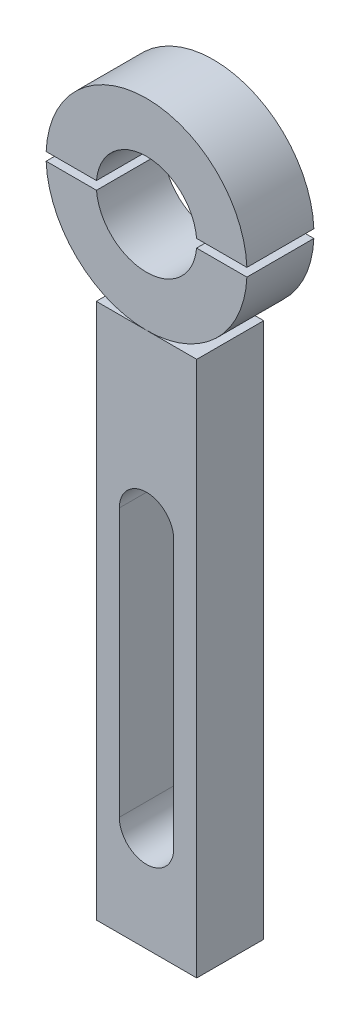
ISO-10303-21;
HEADER;
FILE_DESCRIPTION(('STEP AP214'),'2;1');
FILE_NAME('part.step','',(''),(''),'','','');
FILE_SCHEMA(('AUTOMOTIVE_DESIGN { 1 0 10303 214 1 1 1 1 }'));
ENDSEC;
DATA;
#1=APPLICATION_CONTEXT('core data for automotive mechanical design processes');
#2=APPLICATION_PROTOCOL_DEFINITION('international standard','automotive_design',2000,#1);
#3=PRODUCT_CONTEXT('',#1,'mechanical');
#4=PRODUCT('Part','Part','',(#3));
#5=PRODUCT_RELATED_PRODUCT_CATEGORY('part','',(#4));
#6=PRODUCT_DEFINITION_FORMATION('','',#4);
#7=PRODUCT_DEFINITION_CONTEXT('part definition',#1,'design');
#8=PRODUCT_DEFINITION('design','',#6,#7);
#9=PRODUCT_DEFINITION_SHAPE('','',#8);
#10=(LENGTH_UNIT() NAMED_UNIT(*) SI_UNIT(.MILLI.,.METRE.));
#11=(NAMED_UNIT(*) PLANE_ANGLE_UNIT() SI_UNIT($,.RADIAN.));
#12=(NAMED_UNIT(*) SI_UNIT($,.STERADIAN.) SOLID_ANGLE_UNIT());
#13=UNCERTAINTY_MEASURE_WITH_UNIT(LENGTH_MEASURE(1.E-05),#10,'distance_accuracy_value','');
#14=(GEOMETRIC_REPRESENTATION_CONTEXT(3) GLOBAL_UNCERTAINTY_ASSIGNED_CONTEXT((#13)) GLOBAL_UNIT_ASSIGNED_CONTEXT((#10,
#11,#12)) REPRESENTATION_CONTEXT('',''));
#15=CARTESIAN_POINT('',(0.,0.,0.));
#16=DIRECTION('',(0.,0.,1.));
#17=DIRECTION('',(1.,0.,0.));
#18=AXIS2_PLACEMENT_3D('',#15,#16,#17);
#19=CARTESIAN_POINT('',(-9.52500000000005,-19.05,-6.35000000000008));
#20=DIRECTION('',(-1.,0.,0.));
#21=DIRECTION('',(0.,-1.,0.));
#22=AXIS2_PLACEMENT_3D('',#19,#20,#21);
#23=PLANE('',#22);
#24=DIRECTION('',(0.,-1.,0.));
#25=VECTOR('',#24,1.);
#26=CARTESIAN_POINT('',(-9.52500000000005,-19.05,6.35000000000008));
#27=LINE('',#26,#25);
#28=CARTESIAN_POINT('',(-9.52500000000005,-19.05,6.35000000000008));
#29=VERTEX_POINT('',#28);
#30=CARTESIAN_POINT('',(-9.52500000000005,-120.65,6.35000000000008));
#31=VERTEX_POINT('',#30);
#32=EDGE_CURVE('E146',#29,#31,#27,.T.);
#33=ORIENTED_EDGE('',*,*,#32,.F.);
#34=DIRECTION('',(0.,0.,1.));
#35=VECTOR('',#34,1.);
#36=CARTESIAN_POINT('',(-9.52500000000005,-19.05,-6.35000000000008));
#37=LINE('',#36,#35);
#38=CARTESIAN_POINT('',(-9.52500000000005,-19.05,-6.35000000000008));
#39=VERTEX_POINT('',#38);
#40=EDGE_CURVE('E12',#39,#29,#37,.T.);
#41=ORIENTED_EDGE('',*,*,#40,.F.);
#42=DIRECTION('',(0.,-1.,0.));
#43=VECTOR('',#42,1.);
#44=CARTESIAN_POINT('',(-9.52500000000005,-19.05,-6.35000000000008));
#45=LINE('',#44,#43);
#46=CARTESIAN_POINT('',(-9.52500000000006,-120.65,-6.35000000000008));
#47=VERTEX_POINT('',#46);
#48=EDGE_CURVE('E160',#39,#47,#45,.T.);
#49=ORIENTED_EDGE('',*,*,#48,.T.);
#50=DIRECTION('',(0.,0.,1.));
#51=VECTOR('',#50,1.);
#52=CARTESIAN_POINT('',(-9.52500000000006,-120.65,-6.35000000000008));
#53=LINE('',#52,#51);
#54=EDGE_CURVE('E50',#47,#31,#53,.T.);
#55=ORIENTED_EDGE('',*,*,#54,.T.);
#56=EDGE_LOOP('',(#33,#41,#49,#55));
#57=FACE_BOUND('',#56,.T.);
#58=ADVANCED_FACE('F47',(#57),#23,.T.);
#59=CARTESIAN_POINT('',(-9.52500000000005,-19.05,-6.35000000000008));
#60=DIRECTION('',(0.,1.,0.));
#61=DIRECTION('',(0.,0.,1.));
#62=AXIS2_PLACEMENT_3D('',#59,#60,#61);
#63=PLANE('',#62);
#64=DIRECTION('',(-1.,0.,0.));
#65=VECTOR('',#64,1.);
#66=CARTESIAN_POINT('',(-9.52500000000005,-19.05,6.35000000000008));
#67=LINE('',#66,#65);
#68=CARTESIAN_POINT('',(9.525,-19.05,6.35000000000008));
#69=VERTEX_POINT('',#68);
#70=EDGE_CURVE('E157',#69,#29,#67,.T.);
#71=ORIENTED_EDGE('',*,*,#70,.F.);
#72=DIRECTION('',(0.,0.,1.));
#73=VECTOR('',#72,1.);
#74=CARTESIAN_POINT('',(9.52499999999997,-19.05,-6.35000000000008));
#75=LINE('',#74,#73);
#76=CARTESIAN_POINT('',(9.52499999999997,-19.05,-6.35000000000008));
#77=VERTEX_POINT('',#76);
#78=EDGE_CURVE('E55',#77,#69,#75,.T.);
#79=ORIENTED_EDGE('',*,*,#78,.F.);
#80=DIRECTION('',(-1.,0.,0.));
#81=VECTOR('',#80,1.);
#82=CARTESIAN_POINT('',(-9.52500000000005,-19.05,-6.35000000000008));
#83=LINE('',#82,#81);
#84=EDGE_CURVE('E169',#77,#39,#83,.T.);
#85=ORIENTED_EDGE('',*,*,#84,.T.);
#86=ORIENTED_EDGE('',*,*,#40,.T.);
#87=EDGE_LOOP('',(#71,#79,#85,#86));
#88=FACE_BOUND('',#87,.T.);
#89=ADVANCED_FACE('F183',(#88),#63,.T.);
#90=CARTESIAN_POINT('',(9.52499999999997,-19.05,-6.35000000000008));
#91=DIRECTION('',(1.,0.,0.));
#92=DIRECTION('',(0.,1.,0.));
#93=AXIS2_PLACEMENT_3D('',#90,#91,#92);
#94=PLANE('',#93);
#95=DIRECTION('',(0.,1.,0.));
#96=VECTOR('',#95,1.);
#97=CARTESIAN_POINT('',(9.525,-19.05,6.35000000000008));
#98=LINE('',#97,#96);
#99=CARTESIAN_POINT('',(9.52500000000003,-120.65,6.35000000000008));
#100=VERTEX_POINT('',#99);
#101=EDGE_CURVE('E154',#100,#69,#98,.T.);
#102=ORIENTED_EDGE('',*,*,#101,.F.);
#103=DIRECTION('',(0.,0.,1.));
#104=VECTOR('',#103,1.);
#105=CARTESIAN_POINT('',(9.52500000000003,-120.65,-6.35000000000008));
#106=LINE('',#105,#104);
#107=CARTESIAN_POINT('',(9.52500000000003,-120.65,-6.35000000000008));
#108=VERTEX_POINT('',#107);
#109=EDGE_CURVE('E172',#108,#100,#106,.T.);
#110=ORIENTED_EDGE('',*,*,#109,.F.);
#111=DIRECTION('',(0.,1.,0.));
#112=VECTOR('',#111,1.);
#113=CARTESIAN_POINT('',(9.52499999999997,-19.05,-6.35000000000008));
#114=LINE('',#113,#112);
#115=EDGE_CURVE('E166',#108,#77,#114,.T.);
#116=ORIENTED_EDGE('',*,*,#115,.T.);
#117=ORIENTED_EDGE('',*,*,#78,.T.);
#118=EDGE_LOOP('',(#102,#110,#116,#117));
#119=FACE_BOUND('',#118,.T.);
#120=ADVANCED_FACE('F189',(#119),#94,.T.);
#121=CARTESIAN_POINT('',(-9.52500000000006,-120.65,-6.35000000000008));
#122=DIRECTION('',(0.,-1.,0.));
#123=DIRECTION('',(0.,0.,-1.));
#124=AXIS2_PLACEMENT_3D('',#121,#122,#123);
#125=PLANE('',#124);
#126=DIRECTION('',(1.,0.,0.));
#127=VECTOR('',#126,1.);
#128=CARTESIAN_POINT('',(-9.52500000000005,-120.65,6.35000000000008));
#129=LINE('',#128,#127);
#130=EDGE_CURVE('E151',#31,#100,#129,.T.);
#131=ORIENTED_EDGE('',*,*,#130,.F.);
#132=ORIENTED_EDGE('',*,*,#54,.F.);
#133=DIRECTION('',(1.,0.,0.));
#134=VECTOR('',#133,1.);
#135=CARTESIAN_POINT('',(-9.52500000000006,-120.65,-6.35000000000008));
#136=LINE('',#135,#134);
#137=EDGE_CURVE('E163',#47,#108,#136,.T.);
#138=ORIENTED_EDGE('',*,*,#137,.T.);
#139=ORIENTED_EDGE('',*,*,#109,.T.);
#140=EDGE_LOOP('',(#131,#132,#138,#139));
#141=FACE_BOUND('',#140,.T.);
#142=ADVANCED_FACE('F180',(#141),#125,.T.);
#143=CARTESIAN_POINT('',(-9.52500000000005,-19.05,-6.35000000000008));
#144=DIRECTION('',(0.,0.,1.));
#145=DIRECTION('',(1.,0.,0.));
#146=AXIS2_PLACEMENT_3D('',#143,#144,#145);
#147=PLANE('',#146);
#148=DIRECTION('',(0.,-1.,0.));
#149=VECTOR('',#148,1.);
#150=CARTESIAN_POINT('',(-5.15937500000006,-101.6,-6.35000000000008));
#151=LINE('',#150,#149);
#152=CARTESIAN_POINT('',(-5.15937500000005,-50.8000000000001,-6.35000000000008));
#153=VERTEX_POINT('',#152);
#154=CARTESIAN_POINT('',(-5.15937500000006,-101.6,-6.35000000000008));
#155=VERTEX_POINT('',#154);
#156=EDGE_CURVE('E141',#153,#155,#151,.T.);
#157=ORIENTED_EDGE('',*,*,#156,.T.);
#158=CARTESIAN_POINT('',(0.,-101.6,-6.35000000000008));
#159=DIRECTION('',(0.,0.,1.));
#160=DIRECTION('',(1.,0.,0.));
#161=AXIS2_PLACEMENT_3D('',#158,#159,#160);
#162=CIRCLE('',#161,5.159375);
#163=CARTESIAN_POINT('',(5.15937500000002,-101.6,-6.35000000000008));
#164=VERTEX_POINT('',#163);
#165=EDGE_CURVE('E132',#155,#164,#162,.T.);
#166=ORIENTED_EDGE('',*,*,#165,.T.);
#167=DIRECTION('',(0.,1.,0.));
#168=VECTOR('',#167,1.);
#169=CARTESIAN_POINT('',(5.15937500000001,-50.8000000000001,-6.35000000000008));
#170=LINE('',#169,#168);
#171=CARTESIAN_POINT('',(5.15937500000001,-50.8000000000001,-6.35000000000008));
#172=VERTEX_POINT('',#171);
#173=EDGE_CURVE('E138',#164,#172,#170,.T.);
#174=ORIENTED_EDGE('',*,*,#173,.T.);
#175=CARTESIAN_POINT('',(0.,-50.8,-6.35000000000008));
#176=DIRECTION('',(0.,0.,1.));
#177=DIRECTION('',(-1.,0.,0.));
#178=AXIS2_PLACEMENT_3D('',#175,#176,#177);
#179=CIRCLE('',#178,5.159375);
#180=EDGE_CURVE('E63',#172,#153,#179,.T.);
#181=ORIENTED_EDGE('',*,*,#180,.T.);
#182=EDGE_LOOP('',(#157,#166,#174,#181));
#183=FACE_BOUND('',#182,.T.);
#184=ORIENTED_EDGE('',*,*,#48,.F.);
#185=ORIENTED_EDGE('',*,*,#84,.F.);
#186=ORIENTED_EDGE('',*,*,#115,.F.);
#187=ORIENTED_EDGE('',*,*,#137,.F.);
#188=EDGE_LOOP('',(#184,#185,#186,#187));
#189=FACE_BOUND('',#188,.T.);
#190=ADVANCED_FACE('F186',(#183,#189),#147,.F.);
#191=CARTESIAN_POINT('',(-9.52500000000005,-19.05,6.35000000000008));
#192=DIRECTION('',(0.,0.,1.));
#193=DIRECTION('',(1.,0.,0.));
#194=AXIS2_PLACEMENT_3D('',#191,#192,#193);
#195=PLANE('',#194);
#196=CARTESIAN_POINT('',(0.,-101.6,6.35000000000008));
#197=DIRECTION('',(0.,0.,1.));
#198=DIRECTION('',(1.,0.,0.));
#199=AXIS2_PLACEMENT_3D('',#196,#197,#198);
#200=CIRCLE('',#199,5.159375);
#201=CARTESIAN_POINT('',(-5.15937500000003,-101.6,6.35000000000008));
#202=VERTEX_POINT('',#201);
#203=CARTESIAN_POINT('',(5.15937500000001,-101.6,6.35000000000008));
#204=VERTEX_POINT('',#203);
#205=EDGE_CURVE('E71',#202,#204,#200,.T.);
#206=ORIENTED_EDGE('',*,*,#205,.F.);
#207=DIRECTION('',(0.,-1.,0.));
#208=VECTOR('',#207,1.);
#209=CARTESIAN_POINT('',(-5.15937500000003,-101.6,6.35000000000008));
#210=LINE('',#209,#208);
#211=CARTESIAN_POINT('',(-5.15937500000001,-50.8000000000002,6.35000000000008));
#212=VERTEX_POINT('',#211);
#213=EDGE_CURVE('E130',#212,#202,#210,.T.);
#214=ORIENTED_EDGE('',*,*,#213,.F.);
#215=CARTESIAN_POINT('',(0.,-50.8,6.35000000000008));
#216=DIRECTION('',(0.,0.,1.));
#217=DIRECTION('',(-1.,0.,0.));
#218=AXIS2_PLACEMENT_3D('',#215,#216,#217);
#219=CIRCLE('',#218,5.159375);
#220=CARTESIAN_POINT('',(5.159375,-50.8000000000001,6.35000000000008));
#221=VERTEX_POINT('',#220);
#222=EDGE_CURVE('E114',#221,#212,#219,.T.);
#223=ORIENTED_EDGE('',*,*,#222,.F.);
#224=DIRECTION('',(0.,1.,0.));
#225=VECTOR('',#224,1.);
#226=CARTESIAN_POINT('',(5.159375,-50.8000000000001,6.35000000000008));
#227=LINE('',#226,#225);
#228=EDGE_CURVE('E123',#204,#221,#227,.T.);
#229=ORIENTED_EDGE('',*,*,#228,.F.);
#230=EDGE_LOOP('',(#206,#214,#223,#229));
#231=FACE_BOUND('',#230,.T.);
#232=ORIENTED_EDGE('',*,*,#32,.T.);
#233=ORIENTED_EDGE('',*,*,#130,.T.);
#234=ORIENTED_EDGE('',*,*,#101,.T.);
#235=ORIENTED_EDGE('',*,*,#70,.T.);
#236=EDGE_LOOP('',(#232,#233,#234,#235));
#237=FACE_BOUND('',#236,.T.);
#238=ADVANCED_FACE('F127',(#231,#237),#195,.T.);
#239=CARTESIAN_POINT('',(0.,-101.6,-6.35000000000008));
#240=DIRECTION('',(0.,0.,1.));
#241=DIRECTION('',(1.,0.,0.));
#242=AXIS2_PLACEMENT_3D('',#239,#240,#241);
#243=CYLINDRICAL_SURFACE('',#242,5.159375);
#244=ORIENTED_EDGE('',*,*,#205,.T.);
#245=DIRECTION('',(0.,0.,1.));
#246=VECTOR('',#245,1.);
#247=CARTESIAN_POINT('',(5.15937500000002,-101.6,-6.35000000000008));
#248=LINE('',#247,#246);
#249=EDGE_CURVE('E120',#164,#204,#248,.T.);
#250=ORIENTED_EDGE('',*,*,#249,.F.);
#251=ORIENTED_EDGE('',*,*,#165,.F.);
#252=DIRECTION('',(0.,0.,1.));
#253=VECTOR('',#252,1.);
#254=CARTESIAN_POINT('',(-5.15937500000006,-101.6,-6.35000000000008));
#255=LINE('',#254,#253);
#256=EDGE_CURVE('E144',#155,#202,#255,.T.);
#257=ORIENTED_EDGE('',*,*,#256,.T.);
#258=EDGE_LOOP('',(#244,#250,#251,#257));
#259=FACE_BOUND('',#258,.T.);
#260=ADVANCED_FACE('F232',(#259),#243,.F.);
#261=CARTESIAN_POINT('',(-5.15937500000006,-101.6,-6.35000000000008));
#262=DIRECTION('',(-1.,0.,0.));
#263=DIRECTION('',(0.,-1.,0.));
#264=AXIS2_PLACEMENT_3D('',#261,#262,#263);
#265=PLANE('',#264);
#266=ORIENTED_EDGE('',*,*,#213,.T.);
#267=ORIENTED_EDGE('',*,*,#256,.F.);
#268=ORIENTED_EDGE('',*,*,#156,.F.);
#269=DIRECTION('',(0.,0.,1.));
#270=VECTOR('',#269,1.);
#271=CARTESIAN_POINT('',(-5.15937500000005,-50.8000000000001,-6.35000000000008));
#272=LINE('',#271,#270);
#273=EDGE_CURVE('E119',#153,#212,#272,.T.);
#274=ORIENTED_EDGE('',*,*,#273,.T.);
#275=EDGE_LOOP('',(#266,#267,#268,#274));
#276=FACE_BOUND('',#275,.T.);
#277=ADVANCED_FACE('F241',(#276),#265,.F.);
#278=CARTESIAN_POINT('',(0.,-50.8,-6.35000000000008));
#279=DIRECTION('',(0.,0.,1.));
#280=DIRECTION('',(1.,0.,0.));
#281=AXIS2_PLACEMENT_3D('',#278,#279,#280);
#282=CYLINDRICAL_SURFACE('',#281,5.159375);
#283=ORIENTED_EDGE('',*,*,#222,.T.);
#284=ORIENTED_EDGE('',*,*,#273,.F.);
#285=ORIENTED_EDGE('',*,*,#180,.F.);
#286=DIRECTION('',(0.,0.,1.));
#287=VECTOR('',#286,1.);
#288=CARTESIAN_POINT('',(5.15937500000001,-50.8000000000001,-6.35000000000008));
#289=LINE('',#288,#287);
#290=EDGE_CURVE('E110',#172,#221,#289,.T.);
#291=ORIENTED_EDGE('',*,*,#290,.T.);
#292=EDGE_LOOP('',(#283,#284,#285,#291));
#293=FACE_BOUND('',#292,.T.);
#294=ADVANCED_FACE('F112',(#293),#282,.F.);
#295=CARTESIAN_POINT('',(5.15937500000001,-50.8000000000001,-6.35000000000008));
#296=DIRECTION('',(1.,0.,0.));
#297=DIRECTION('',(0.,1.,0.));
#298=AXIS2_PLACEMENT_3D('',#295,#296,#297);
#299=PLANE('',#298);
#300=ORIENTED_EDGE('',*,*,#228,.T.);
#301=ORIENTED_EDGE('',*,*,#290,.F.);
#302=ORIENTED_EDGE('',*,*,#173,.F.);
#303=ORIENTED_EDGE('',*,*,#249,.T.);
#304=EDGE_LOOP('',(#300,#301,#302,#303));
#305=FACE_BOUND('',#304,.T.);
#306=ADVANCED_FACE('F124',(#305),#299,.F.);
#307=CLOSED_SHELL('',(#58,#89,#120,#142,#190,#238,#260,#277,#294,#306));
#308=MANIFOLD_SOLID_BREP('B2',#307);
#309=CARTESIAN_POINT('',(0.,0.,6.35000000000008));
#310=DIRECTION('',(0.,0.,-1.));
#311=DIRECTION('',(-1.,0.,0.));
#312=AXIS2_PLACEMENT_3D('',#309,#310,#311);
#313=CYLINDRICAL_SURFACE('',#312,9.52500000000001);
#314=CARTESIAN_POINT('',(0.,0.,-6.35000000000008));
#315=DIRECTION('',(0.,0.,-1.));
#316=DIRECTION('',(1.,0.,0.));
#317=AXIS2_PLACEMENT_3D('',#314,#315,#316);
#318=CIRCLE('',#317,9.52500000000001);
#319=CARTESIAN_POINT('',(9.49186946483675,-0.793749999999926,-6.35000000000008));
#320=VERTEX_POINT('',#319);
#321=CARTESIAN_POINT('',(-9.4918694648368,-0.793749999999926,-6.35000000000008));
#322=VERTEX_POINT('',#321);
#323=EDGE_CURVE('E329',#320,#322,#318,.T.);
#324=ORIENTED_EDGE('',*,*,#323,.T.);
#325=DIRECTION('',(0.,0.,-1.));
#326=VECTOR('',#325,1.);
#327=CARTESIAN_POINT('',(-9.49186946483675,-0.793750000000135,6.35000000000008));
#328=LINE('',#327,#326);
#329=CARTESIAN_POINT('',(-9.49186946483675,-0.793750000000135,6.35000000000008));
#330=VERTEX_POINT('',#329);
#331=EDGE_CURVE('E45',#330,#322,#328,.T.);
#332=ORIENTED_EDGE('',*,*,#331,.F.);
#333=CARTESIAN_POINT('',(0.,0.,6.35000000000008));
#334=DIRECTION('',(0.,0.,-1.));
#335=DIRECTION('',(1.,0.,0.));
#336=AXIS2_PLACEMENT_3D('',#333,#334,#335);
#337=CIRCLE('',#336,9.52500000000001);
#338=CARTESIAN_POINT('',(9.49186946483675,-0.793749999999926,6.35000000000008));
#339=VERTEX_POINT('',#338);
#340=EDGE_CURVE('E347',#339,#330,#337,.T.);
#341=ORIENTED_EDGE('',*,*,#340,.F.);
#342=DIRECTION('',(0.,0.,-1.));
#343=VECTOR('',#342,1.);
#344=CARTESIAN_POINT('',(9.49186946483675,-0.793749999999926,6.35000000000008));
#345=LINE('',#344,#343);
#346=EDGE_CURVE('E341',#339,#320,#345,.T.);
#347=ORIENTED_EDGE('',*,*,#346,.T.);
#348=EDGE_LOOP('',(#324,#332,#341,#347));
#349=FACE_BOUND('',#348,.T.);
#350=ADVANCED_FACE('F285',(#349),#313,.F.);
#351=CARTESIAN_POINT('',(-9.49186946483675,-0.793750000000135,6.35000000000008));
#352=DIRECTION('',(0.,-1.,0.));
#353=DIRECTION('',(0.,0.,-1.));
#354=AXIS2_PLACEMENT_3D('',#351,#352,#353);
#355=PLANE('',#354);
#356=DIRECTION('',(-1.,0.,0.));
#357=VECTOR('',#356,1.);
#358=CARTESIAN_POINT('',(-9.4918694648368,-0.793749999999926,-6.35000000000008));
#359=LINE('',#358,#357);
#360=CARTESIAN_POINT('',(-19.0334563581475,-0.793749999999746,-6.35000000000008));
#361=VERTEX_POINT('',#360);
#362=EDGE_CURVE('E325',#322,#361,#359,.T.);
#363=ORIENTED_EDGE('',*,*,#362,.T.);
#364=DIRECTION('',(0.,0.,-1.));
#365=VECTOR('',#364,1.);
#366=CARTESIAN_POINT('',(-19.0334563581475,-0.793749999999746,6.35000000000008));
#367=LINE('',#366,#365);
#368=CARTESIAN_POINT('',(-19.0334563581475,-0.793749999999746,6.35000000000008));
#369=VERTEX_POINT('',#368);
#370=EDGE_CURVE('E292',#369,#361,#367,.T.);
#371=ORIENTED_EDGE('',*,*,#370,.F.);
#372=DIRECTION('',(-1.,0.,0.));
#373=VECTOR('',#372,1.);
#374=CARTESIAN_POINT('',(-9.49186946483675,-0.793750000000135,6.35000000000008));
#375=LINE('',#374,#373);
#376=EDGE_CURVE('E337',#330,#369,#375,.T.);
#377=ORIENTED_EDGE('',*,*,#376,.F.);
#378=ORIENTED_EDGE('',*,*,#331,.T.);
#379=EDGE_LOOP('',(#363,#371,#377,#378));
#380=FACE_BOUND('',#379,.T.);
#381=ADVANCED_FACE('F336',(#380),#355,.F.);
#382=CARTESIAN_POINT('',(0.,0.,6.35000000000008));
#383=DIRECTION('',(0.,0.,-1.));
#384=DIRECTION('',(-1.,0.,0.));
#385=AXIS2_PLACEMENT_3D('',#382,#383,#384);
#386=CYLINDRICAL_SURFACE('',#385,19.05);
#387=CARTESIAN_POINT('',(0.,0.,-6.35000000000008));
#388=DIRECTION('',(0.,0.,1.));
#389=DIRECTION('',(1.,0.,0.));
#390=AXIS2_PLACEMENT_3D('',#387,#388,#389);
#391=CIRCLE('',#390,19.05);
#392=CARTESIAN_POINT('',(19.0334563581474,-0.793749999999926,-6.35000000000008));
#393=VERTEX_POINT('',#392);
#394=EDGE_CURVE('E330',#361,#393,#391,.T.);
#395=ORIENTED_EDGE('',*,*,#394,.T.);
#396=DIRECTION('',(0.,0.,-1.));
#397=VECTOR('',#396,1.);
#398=CARTESIAN_POINT('',(19.0334563581474,-0.793749999999926,6.35000000000008));
#399=LINE('',#398,#397);
#400=CARTESIAN_POINT('',(19.0334563581474,-0.793749999999926,6.35000000000008));
#401=VERTEX_POINT('',#400);
#402=EDGE_CURVE('E353',#401,#393,#399,.T.);
#403=ORIENTED_EDGE('',*,*,#402,.F.);
#404=CARTESIAN_POINT('',(0.,0.,6.35000000000008));
#405=DIRECTION('',(0.,0.,1.));
#406=DIRECTION('',(1.,0.,0.));
#407=AXIS2_PLACEMENT_3D('',#404,#405,#406);
#408=CIRCLE('',#407,19.05);
#409=EDGE_CURVE('E304',#369,#401,#408,.T.);
#410=ORIENTED_EDGE('',*,*,#409,.F.);
#411=ORIENTED_EDGE('',*,*,#370,.T.);
#412=EDGE_LOOP('',(#395,#403,#410,#411));
#413=FACE_BOUND('',#412,.T.);
#414=ADVANCED_FACE('F356',(#413),#386,.T.);
#415=CARTESIAN_POINT('',(19.0334563581474,-0.793749999999926,6.35000000000008));
#416=DIRECTION('',(0.,-1.,0.));
#417=DIRECTION('',(0.,0.,-1.));
#418=AXIS2_PLACEMENT_3D('',#415,#416,#417);
#419=PLANE('',#418);
#420=DIRECTION('',(-1.,0.,0.));
#421=VECTOR('',#420,1.);
#422=CARTESIAN_POINT('',(19.0334563581474,-0.793749999999926,-6.35000000000008));
#423=LINE('',#422,#421);
#424=EDGE_CURVE('E345',#393,#320,#423,.T.);
#425=ORIENTED_EDGE('',*,*,#424,.T.);
#426=ORIENTED_EDGE('',*,*,#346,.F.);
#427=DIRECTION('',(-1.,0.,0.));
#428=VECTOR('',#427,1.);
#429=CARTESIAN_POINT('',(19.0334563581474,-0.793749999999926,6.35000000000008));
#430=LINE('',#429,#428);
#431=EDGE_CURVE('E299',#401,#339,#430,.T.);
#432=ORIENTED_EDGE('',*,*,#431,.F.);
#433=ORIENTED_EDGE('',*,*,#402,.T.);
#434=EDGE_LOOP('',(#425,#426,#432,#433));
#435=FACE_BOUND('',#434,.T.);
#436=ADVANCED_FACE('F358',(#435),#419,.F.);
#437=CARTESIAN_POINT('',(0.,0.,6.35000000000008));
#438=DIRECTION('',(0.,0.,1.));
#439=DIRECTION('',(1.,0.,0.));
#440=AXIS2_PLACEMENT_3D('',#437,#438,#439);
#441=PLANE('',#440);
#442=ORIENTED_EDGE('',*,*,#340,.T.);
#443=ORIENTED_EDGE('',*,*,#376,.T.);
#444=ORIENTED_EDGE('',*,*,#409,.T.);
#445=ORIENTED_EDGE('',*,*,#431,.T.);
#446=EDGE_LOOP('',(#442,#443,#444,#445));
#447=FACE_BOUND('',#446,.T.);
#448=ADVANCED_FACE('F359',(#447),#441,.T.);
#449=CARTESIAN_POINT('',(0.,0.,-6.35000000000008));
#450=DIRECTION('',(0.,0.,1.));
#451=DIRECTION('',(1.,0.,0.));
#452=AXIS2_PLACEMENT_3D('',#449,#450,#451);
#453=PLANE('',#452);
#454=ORIENTED_EDGE('',*,*,#323,.F.);
#455=ORIENTED_EDGE('',*,*,#424,.F.);
#456=ORIENTED_EDGE('',*,*,#394,.F.);
#457=ORIENTED_EDGE('',*,*,#362,.F.);
#458=EDGE_LOOP('',(#454,#455,#456,#457));
#459=FACE_BOUND('',#458,.T.);
#460=ADVANCED_FACE('F326',(#459),#453,.F.);
#461=CLOSED_SHELL('',(#350,#381,#414,#436,#448,#460));
#462=MANIFOLD_SOLID_BREP('B6',#461);
#463=CARTESIAN_POINT('',(0.,0.,6.35000000000008));
#464=DIRECTION('',(0.,0.,-1.));
#465=DIRECTION('',(-1.,0.,0.));
#466=AXIS2_PLACEMENT_3D('',#463,#464,#465);
#467=CYLINDRICAL_SURFACE('',#466,9.525);
#468=CARTESIAN_POINT('',(0.,0.,-6.35000000000008));
#469=DIRECTION('',(0.,0.,-1.));
#470=DIRECTION('',(1.,0.,0.));
#471=AXIS2_PLACEMENT_3D('',#468,#469,#470);
#472=CIRCLE('',#471,9.525);
#473=CARTESIAN_POINT('',(-9.49186946483679,0.793750000000287,-6.35000000000008));
#474=VERTEX_POINT('',#473);
#475=CARTESIAN_POINT('',(9.49186946483668,0.793750000000065,-6.35000000000008));
#476=VERTEX_POINT('',#475);
#477=EDGE_CURVE('E452',#474,#476,#472,.T.);
#478=ORIENTED_EDGE('',*,*,#477,.T.);
#479=DIRECTION('',(0.,0.,-1.));
#480=VECTOR('',#479,1.);
#481=CARTESIAN_POINT('',(9.49186946483675,0.793749999999857,6.35000000000008));
#482=LINE('',#481,#480);
#483=CARTESIAN_POINT('',(9.49186946483675,0.793749999999857,6.35000000000008));
#484=VERTEX_POINT('',#483);
#485=EDGE_CURVE('E283',#484,#476,#482,.T.);
#486=ORIENTED_EDGE('',*,*,#485,.F.);
#487=CARTESIAN_POINT('',(0.,0.,6.35000000000008));
#488=DIRECTION('',(0.,0.,-1.));
#489=DIRECTION('',(1.,0.,0.));
#490=AXIS2_PLACEMENT_3D('',#487,#488,#489);
#491=CIRCLE('',#490,9.525);
#492=CARTESIAN_POINT('',(-9.49186946483677,0.793750000000287,6.35000000000008));
#493=VERTEX_POINT('',#492);
#494=EDGE_CURVE('E470',#493,#484,#491,.T.);
#495=ORIENTED_EDGE('',*,*,#494,.F.);
#496=DIRECTION('',(0.,0.,-1.));
#497=VECTOR('',#496,1.);
#498=CARTESIAN_POINT('',(-9.49186946483677,0.793750000000287,6.35000000000008));
#499=LINE('',#498,#497);
#500=EDGE_CURVE('E464',#493,#474,#499,.T.);
#501=ORIENTED_EDGE('',*,*,#500,.T.);
#502=EDGE_LOOP('',(#478,#486,#495,#501));
#503=FACE_BOUND('',#502,.T.);
#504=ADVANCED_FACE('F408',(#503),#467,.F.);
#505=CARTESIAN_POINT('',(9.49186946483675,0.793749999999857,6.35000000000008));
#506=DIRECTION('',(0.,1.,0.));
#507=DIRECTION('',(0.,0.,1.));
#508=AXIS2_PLACEMENT_3D('',#505,#506,#507);
#509=PLANE('',#508);
#510=DIRECTION('',(1.,0.,0.));
#511=VECTOR('',#510,1.);
#512=CARTESIAN_POINT('',(9.49186946483668,0.793750000000065,-6.35000000000008));
#513=LINE('',#512,#511);
#514=CARTESIAN_POINT('',(19.0334563581474,0.793750000000121,-6.35000000000008));
#515=VERTEX_POINT('',#514);
#516=EDGE_CURVE('E448',#476,#515,#513,.T.);
#517=ORIENTED_EDGE('',*,*,#516,.T.);
#518=DIRECTION('',(0.,0.,-1.));
#519=VECTOR('',#518,1.);
#520=CARTESIAN_POINT('',(19.0334563581474,0.793750000000079,6.35000000000008));
#521=LINE('',#520,#519);
#522=CARTESIAN_POINT('',(19.0334563581474,0.793750000000079,6.35000000000008));
#523=VERTEX_POINT('',#522);
#524=EDGE_CURVE('E415',#523,#515,#521,.T.);
#525=ORIENTED_EDGE('',*,*,#524,.F.);
#526=DIRECTION('',(1.,0.,0.));
#527=VECTOR('',#526,1.);
#528=CARTESIAN_POINT('',(9.49186946483675,0.793749999999857,6.35000000000008));
#529=LINE('',#528,#527);
#530=EDGE_CURVE('E460',#484,#523,#529,.T.);
#531=ORIENTED_EDGE('',*,*,#530,.F.);
#532=ORIENTED_EDGE('',*,*,#485,.T.);
#533=EDGE_LOOP('',(#517,#525,#531,#532));
#534=FACE_BOUND('',#533,.T.);
#535=ADVANCED_FACE('F459',(#534),#509,.F.);
#536=CARTESIAN_POINT('',(0.,0.,6.35000000000008));
#537=DIRECTION('',(0.,0.,-1.));
#538=DIRECTION('',(-1.,0.,0.));
#539=AXIS2_PLACEMENT_3D('',#536,#537,#538);
#540=CYLINDRICAL_SURFACE('',#539,19.05);
#541=CARTESIAN_POINT('',(0.,0.,-6.35000000000008));
#542=DIRECTION('',(0.,0.,1.));
#543=DIRECTION('',(1.,0.,0.));
#544=AXIS2_PLACEMENT_3D('',#541,#542,#543);
#545=CIRCLE('',#544,19.05);
#546=CARTESIAN_POINT('',(-19.0334563581474,0.793750000000065,-6.35000000000008));
#547=VERTEX_POINT('',#546);
#548=EDGE_CURVE('E453',#515,#547,#545,.T.);
#549=ORIENTED_EDGE('',*,*,#548,.T.);
#550=DIRECTION('',(0.,0.,-1.));
#551=VECTOR('',#550,1.);
#552=CARTESIAN_POINT('',(-19.0334563581474,0.793750000000065,6.35000000000008));
#553=LINE('',#552,#551);
#554=CARTESIAN_POINT('',(-19.0334563581474,0.793750000000065,6.35000000000008));
#555=VERTEX_POINT('',#554);
#556=EDGE_CURVE('E476',#555,#547,#553,.T.);
#557=ORIENTED_EDGE('',*,*,#556,.F.);
#558=CARTESIAN_POINT('',(0.,0.,6.35000000000008));
#559=DIRECTION('',(0.,0.,1.));
#560=DIRECTION('',(1.,0.,0.));
#561=AXIS2_PLACEMENT_3D('',#558,#559,#560);
#562=CIRCLE('',#561,19.05);
#563=EDGE_CURVE('E427',#523,#555,#562,.T.);
#564=ORIENTED_EDGE('',*,*,#563,.F.);
#565=ORIENTED_EDGE('',*,*,#524,.T.);
#566=EDGE_LOOP('',(#549,#557,#564,#565));
#567=FACE_BOUND('',#566,.T.);
#568=ADVANCED_FACE('F479',(#567),#540,.T.);
#569=CARTESIAN_POINT('',(-19.0334563581474,0.793750000000065,6.35000000000008));
#570=DIRECTION('',(0.,1.,0.));
#571=DIRECTION('',(0.,0.,1.));
#572=AXIS2_PLACEMENT_3D('',#569,#570,#571);
#573=PLANE('',#572);
#574=DIRECTION('',(1.,0.,0.));
#575=VECTOR('',#574,1.);
#576=CARTESIAN_POINT('',(-19.0334563581474,0.793750000000065,-6.35000000000008));
#577=LINE('',#576,#575);
#578=EDGE_CURVE('E468',#547,#474,#577,.T.);
#579=ORIENTED_EDGE('',*,*,#578,.T.);
#580=ORIENTED_EDGE('',*,*,#500,.F.);
#581=DIRECTION('',(1.,0.,0.));
#582=VECTOR('',#581,1.);
#583=CARTESIAN_POINT('',(-19.0334563581474,0.793750000000065,6.35000000000008));
#584=LINE('',#583,#582);
#585=EDGE_CURVE('E422',#555,#493,#584,.T.);
#586=ORIENTED_EDGE('',*,*,#585,.F.);
#587=ORIENTED_EDGE('',*,*,#556,.T.);
#588=EDGE_LOOP('',(#579,#580,#586,#587));
#589=FACE_BOUND('',#588,.T.);
#590=ADVANCED_FACE('F481',(#589),#573,.F.);
#591=CARTESIAN_POINT('',(0.,0.,6.35000000000008));
#592=DIRECTION('',(0.,0.,1.));
#593=DIRECTION('',(1.,0.,0.));
#594=AXIS2_PLACEMENT_3D('',#591,#592,#593);
#595=PLANE('',#594);
#596=ORIENTED_EDGE('',*,*,#494,.T.);
#597=ORIENTED_EDGE('',*,*,#530,.T.);
#598=ORIENTED_EDGE('',*,*,#563,.T.);
#599=ORIENTED_EDGE('',*,*,#585,.T.);
#600=EDGE_LOOP('',(#596,#597,#598,#599));
#601=FACE_BOUND('',#600,.T.);
#602=ADVANCED_FACE('F482',(#601),#595,.T.);
#603=CARTESIAN_POINT('',(0.,0.,-6.35000000000008));
#604=DIRECTION('',(0.,0.,1.));
#605=DIRECTION('',(1.,0.,0.));
#606=AXIS2_PLACEMENT_3D('',#603,#604,#605);
#607=PLANE('',#606);
#608=ORIENTED_EDGE('',*,*,#477,.F.);
#609=ORIENTED_EDGE('',*,*,#578,.F.);
#610=ORIENTED_EDGE('',*,*,#548,.F.);
#611=ORIENTED_EDGE('',*,*,#516,.F.);
#612=EDGE_LOOP('',(#608,#609,#610,#611));
#613=FACE_BOUND('',#612,.T.);
#614=ADVANCED_FACE('F449',(#613),#607,.F.);
#615=CLOSED_SHELL('',(#504,#535,#568,#590,#602,#614));
#616=MANIFOLD_SOLID_BREP('B39',#615);
#617=ADVANCED_BREP_SHAPE_REPRESENTATION('',(#18,#308,#462,#616),#14);
#618=SHAPE_DEFINITION_REPRESENTATION(#9,#617);
ENDSEC;
END-ISO-10303-21;
